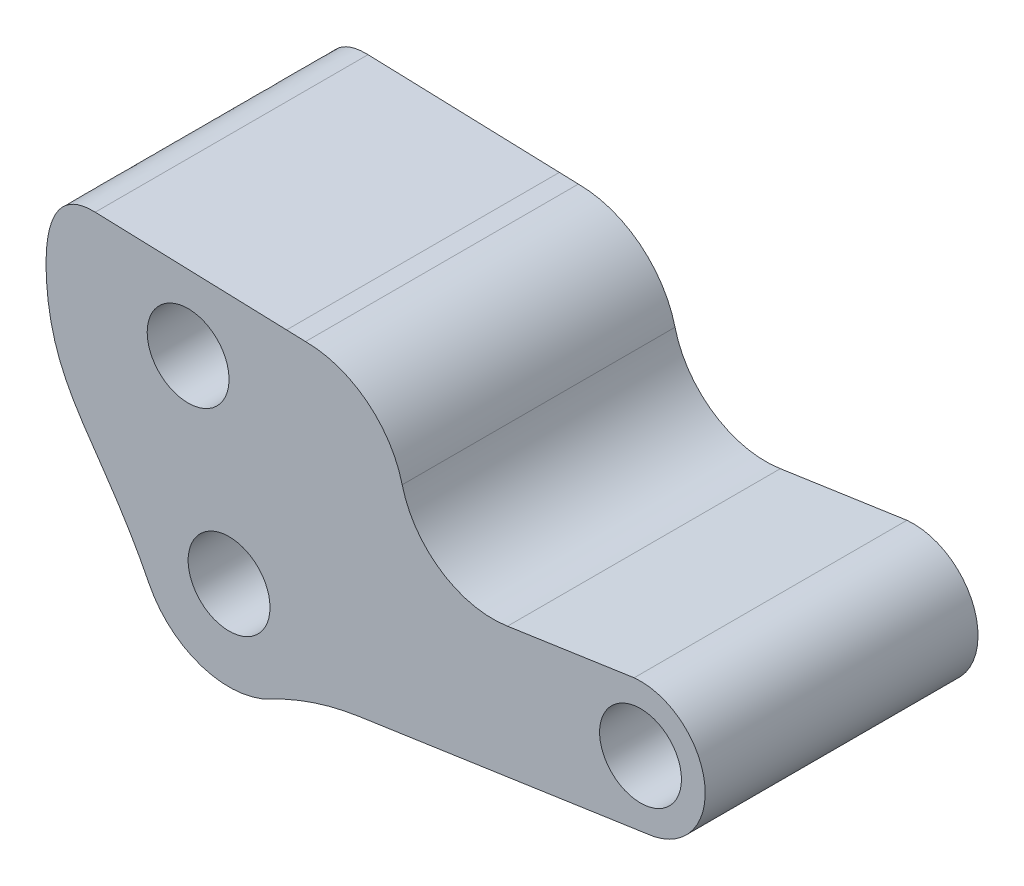
ISO-10303-21;
HEADER;
FILE_DESCRIPTION(('STEP AP214'),'2;1');
FILE_NAME('part.step','',(''),(''),'','','');
FILE_SCHEMA(('AUTOMOTIVE_DESIGN { 1 0 10303 214 1 1 1 1 }'));
ENDSEC;
DATA;
#1=APPLICATION_CONTEXT('core data for automotive mechanical design processes');
#2=APPLICATION_PROTOCOL_DEFINITION('international standard','automotive_design',2000,#1);
#3=PRODUCT_CONTEXT('',#1,'mechanical');
#4=PRODUCT('Part','Part','',(#3));
#5=PRODUCT_RELATED_PRODUCT_CATEGORY('part','',(#4));
#6=PRODUCT_DEFINITION_FORMATION('','',#4);
#7=PRODUCT_DEFINITION_CONTEXT('part definition',#1,'design');
#8=PRODUCT_DEFINITION('design','',#6,#7);
#9=PRODUCT_DEFINITION_SHAPE('','',#8);
#10=(LENGTH_UNIT() NAMED_UNIT(*) SI_UNIT(.MILLI.,.METRE.));
#11=(NAMED_UNIT(*) PLANE_ANGLE_UNIT() SI_UNIT($,.RADIAN.));
#12=(NAMED_UNIT(*) SI_UNIT($,.STERADIAN.) SOLID_ANGLE_UNIT());
#13=UNCERTAINTY_MEASURE_WITH_UNIT(LENGTH_MEASURE(1.E-05),#10,'distance_accuracy_value','');
#14=(GEOMETRIC_REPRESENTATION_CONTEXT(3) GLOBAL_UNCERTAINTY_ASSIGNED_CONTEXT((#13)) GLOBAL_UNIT_ASSIGNED_CONTEXT((#10,
#11,#12)) REPRESENTATION_CONTEXT('',''));
#15=CARTESIAN_POINT('',(0.,0.,0.));
#16=DIRECTION('',(0.,0.,1.));
#17=DIRECTION('',(1.,0.,0.));
#18=AXIS2_PLACEMENT_3D('',#15,#16,#17);
#19=CARTESIAN_POINT('',(158.097461394552,151.287034217778,10.));
#20=CARTESIAN_POINT('',(158.325870366883,151.272612557795,10.));
#21=CARTESIAN_POINT('',(158.557802913186,151.26421995616,10.));
#22=CARTESIAN_POINT('',(158.793350908443,151.26421995616,10.));
#23=B_SPLINE_CURVE_WITH_KNOTS('',3,(#19,#20,#21,#22),.UNSPECIFIED.,.F.,.F.,(4,4),
(0.972871191917009,1.),.UNSPECIFIED.);
#24=DIRECTION('',(0.,0.,-1.));
#25=VECTOR('',#24,1.);
#26=SURFACE_OF_LINEAR_EXTRUSION('',#23,#25);
#27=CARTESIAN_POINT('',(158.097461394552,151.287034217778,0.));
#28=CARTESIAN_POINT('',(158.325870366883,151.272612557795,0.));
#29=CARTESIAN_POINT('',(158.557802913186,151.26421995616,0.));
#30=CARTESIAN_POINT('',(158.793350908443,151.26421995616,0.));
#31=B_SPLINE_CURVE_WITH_KNOTS('',3,(#27,#28,#29,#30),.UNSPECIFIED.,.F.,.F.,(4,4),
(0.972871191917009,1.),.UNSPECIFIED.);
#32=CARTESIAN_POINT('',(158.097461394552,151.287034217778,0.));
#33=VERTEX_POINT('',#32);
#34=CARTESIAN_POINT('',(158.793350908443,151.26421995616,0.));
#35=VERTEX_POINT('',#34);
#36=EDGE_CURVE('E148',#33,#35,#31,.T.);
#37=ORIENTED_EDGE('',*,*,#36,.F.);
#38=DIRECTION('',(0.,0.,-1.));
#39=VECTOR('',#38,1.);
#40=CARTESIAN_POINT('',(158.097461394552,151.287034217778,10.));
#41=LINE('',#40,#39);
#42=CARTESIAN_POINT('',(158.097461394552,151.287034217778,10.));
#43=VERTEX_POINT('',#42);
#44=EDGE_CURVE('E11',#43,#33,#41,.T.);
#45=ORIENTED_EDGE('',*,*,#44,.F.);
#46=CARTESIAN_POINT('',(158.793350908443,151.26421995616,10.));
#47=VERTEX_POINT('',#46);
#48=EDGE_CURVE('E186',#43,#47,#23,.T.);
#49=ORIENTED_EDGE('',*,*,#48,.T.);
#50=DIRECTION('',(0.,0.,-1.));
#51=VECTOR('',#50,1.);
#52=CARTESIAN_POINT('',(158.793350908443,151.26421995616,10.));
#53=LINE('',#52,#51);
#54=EDGE_CURVE('E92',#47,#35,#53,.T.);
#55=ORIENTED_EDGE('',*,*,#54,.T.);
#56=EDGE_LOOP('',(#37,#45,#49,#55));
#57=FACE_BOUND('',#56,.T.);
#58=ADVANCED_FACE('F35',(#57),#26,.T.);
#59=CARTESIAN_POINT('',(5.12425924973423,156.302155993108,10.));
#60=DIRECTION('',(-0.0327667115596233,-0.999463027136856,0.));
#61=DIRECTION('',(0.999463027136856,-0.0327667115596233,0.));
#62=AXIS2_PLACEMENT_3D('',#59,#60,#61);
#63=PLANE('',#62);
#64=DIRECTION('',(-0.999463027136856,0.0327667115596233,0.));
#65=VECTOR('',#64,1.);
#66=CARTESIAN_POINT('',(5.12425924973423,156.302155993108,0.));
#67=LINE('',#66,#65);
#68=CARTESIAN_POINT('',(151.083645878014,151.516977360969,0.));
#69=VERTEX_POINT('',#68);
#70=EDGE_CURVE('E153',#33,#69,#67,.T.);
#71=ORIENTED_EDGE('',*,*,#70,.T.);
#72=DIRECTION('',(0.,0.,-1.));
#73=VECTOR('',#72,1.);
#74=CARTESIAN_POINT('',(151.083645878014,151.516977360969,10.));
#75=LINE('',#74,#73);
#76=CARTESIAN_POINT('',(151.083645878014,151.516977360969,10.));
#77=VERTEX_POINT('',#76);
#78=EDGE_CURVE('E44',#77,#69,#75,.T.);
#79=ORIENTED_EDGE('',*,*,#78,.F.);
#80=DIRECTION('',(-0.999463027136856,0.0327667115596233,0.));
#81=VECTOR('',#80,1.);
#82=CARTESIAN_POINT('',(5.12425924973423,156.302155993108,10.));
#83=LINE('',#82,#81);
#84=EDGE_CURVE('E237',#43,#77,#83,.T.);
#85=ORIENTED_EDGE('',*,*,#84,.F.);
#86=ORIENTED_EDGE('',*,*,#44,.T.);
#87=EDGE_LOOP('',(#71,#79,#85,#86));
#88=FACE_BOUND('',#87,.T.);
#89=ADVANCED_FACE('F244',(#88),#63,.F.);
#90=CARTESIAN_POINT('',(151.083645878014,151.516977360969,10.));
#91=CARTESIAN_POINT('',(149.34252916832,151.574058681107,10.));
#92=CARTESIAN_POINT('',(148.841703129865,145.368566224032,10.));
#93=CARTESIAN_POINT('',(151.284095970482,144.263107249584,10.));
#94=CARTESIAN_POINT('',(153.059001839225,140.708421316186,10.));
#95=B_SPLINE_CURVE_WITH_KNOTS('',3,(#90,#91,#92,#93,#94),.UNSPECIFIED.,.F.,.F.,(4,1,4),(0.,
0.305758730908958,1.),.UNSPECIFIED.);
#96=DIRECTION('',(0.,0.,-1.));
#97=VECTOR('',#96,1.);
#98=SURFACE_OF_LINEAR_EXTRUSION('',#95,#97);
#99=CARTESIAN_POINT('',(151.083645878014,151.516977360969,0.));
#100=CARTESIAN_POINT('',(149.34252916832,151.574058681107,0.));
#101=CARTESIAN_POINT('',(148.841703129865,145.368566224032,0.));
#102=CARTESIAN_POINT('',(151.284095970482,144.263107249584,0.));
#103=CARTESIAN_POINT('',(153.059001839225,140.708421316186,0.));
#104=B_SPLINE_CURVE_WITH_KNOTS('',3,(#99,#100,#101,#102,#103),.UNSPECIFIED.,.F.,.F.,(4,1,4),(0.,
0.305758730908958,1.),.UNSPECIFIED.);
#105=CARTESIAN_POINT('',(153.059001839224,140.708421316186,0.));
#106=VERTEX_POINT('',#105);
#107=EDGE_CURVE('E159',#69,#106,#104,.T.);
#108=ORIENTED_EDGE('',*,*,#107,.T.);
#109=DIRECTION('',(0.,0.,-1.));
#110=VECTOR('',#109,1.);
#111=CARTESIAN_POINT('',(153.059001839224,140.708421316186,10.));
#112=LINE('',#111,#110);
#113=CARTESIAN_POINT('',(153.059001839224,140.708421316186,10.));
#114=VERTEX_POINT('',#113);
#115=EDGE_CURVE('E199',#114,#106,#112,.T.);
#116=ORIENTED_EDGE('',*,*,#115,.F.);
#117=EDGE_CURVE('E208',#77,#114,#95,.T.);
#118=ORIENTED_EDGE('',*,*,#117,.F.);
#119=ORIENTED_EDGE('',*,*,#78,.T.);
#120=EDGE_LOOP('',(#108,#116,#118,#119));
#121=FACE_BOUND('',#120,.T.);
#122=ADVANCED_FACE('F206',(#121),#98,.F.);
#123=CARTESIAN_POINT('',(155.989754871759,142.17178850382,10.));
#124=DIRECTION('',(0.,0.,-1.));
#125=DIRECTION('',(-1.,0.,0.));
#126=AXIS2_PLACEMENT_3D('',#123,#124,#125);
#127=CYLINDRICAL_SURFACE('',#126,3.27578339692294);
#128=CARTESIAN_POINT('',(155.989754871759,142.17178850382,0.));
#129=DIRECTION('',(0.,0.,1.));
#130=DIRECTION('',(1.,0.,0.));
#131=AXIS2_PLACEMENT_3D('',#128,#129,#130);
#132=CIRCLE('',#131,3.27578339692294);
#133=CARTESIAN_POINT('',(157.529461724964,139.28041172627,0.));
#134=VERTEX_POINT('',#133);
#135=EDGE_CURVE('E163',#106,#134,#132,.T.);
#136=ORIENTED_EDGE('',*,*,#135,.T.);
#137=DIRECTION('',(0.,0.,-1.));
#138=VECTOR('',#137,1.);
#139=CARTESIAN_POINT('',(157.529461724964,139.28041172627,10.));
#140=LINE('',#139,#138);
#141=CARTESIAN_POINT('',(157.529461724964,139.28041172627,10.));
#142=VERTEX_POINT('',#141);
#143=EDGE_CURVE('E196',#142,#134,#140,.T.);
#144=ORIENTED_EDGE('',*,*,#143,.F.);
#145=CARTESIAN_POINT('',(155.989754871759,142.17178850382,10.));
#146=DIRECTION('',(0.,0.,1.));
#147=DIRECTION('',(1.,0.,0.));
#148=AXIS2_PLACEMENT_3D('',#145,#146,#147);
#149=CIRCLE('',#148,3.27578339692294);
#150=EDGE_CURVE('E228',#114,#142,#149,.T.);
#151=ORIENTED_EDGE('',*,*,#150,.F.);
#152=ORIENTED_EDGE('',*,*,#115,.T.);
#153=EDGE_LOOP('',(#136,#144,#151,#152));
#154=FACE_BOUND('',#153,.T.);
#155=ADVANCED_FACE('F219',(#154),#127,.T.);
#156=CARTESIAN_POINT('',(162.229732367558,130.453891693644,10.));
#157=DIRECTION('',(0.,0.,-1.));
#158=DIRECTION('',(-1.,0.,0.));
#159=AXIS2_PLACEMENT_3D('',#156,#157,#158);
#160=CYLINDRICAL_SURFACE('',#159,9.99999999999886);
#161=CARTESIAN_POINT('',(162.229732367558,130.453891693644,0.));
#162=DIRECTION('',(0.,0.,1.));
#163=DIRECTION('',(1.,0.,0.));
#164=AXIS2_PLACEMENT_3D('',#161,#162,#163);
#165=CIRCLE('',#164,9.99999999999886);
#166=CARTESIAN_POINT('',(160.775008350177,140.347514793057,0.));
#167=VERTEX_POINT('',#166);
#168=EDGE_CURVE('E168',#134,#167,#165,.F.);
#169=ORIENTED_EDGE('',*,*,#168,.T.);
#170=DIRECTION('',(0.,0.,-1.));
#171=VECTOR('',#170,1.);
#172=CARTESIAN_POINT('',(160.775008350177,140.347514793057,10.));
#173=LINE('',#172,#171);
#174=CARTESIAN_POINT('',(160.775008350177,140.347514793057,10.));
#175=VERTEX_POINT('',#174);
#176=EDGE_CURVE('E193',#175,#167,#173,.T.);
#177=ORIENTED_EDGE('',*,*,#176,.F.);
#178=CARTESIAN_POINT('',(162.229732367558,130.453891693644,10.));
#179=DIRECTION('',(0.,0.,1.));
#180=DIRECTION('',(1.,0.,0.));
#181=AXIS2_PLACEMENT_3D('',#178,#179,#180);
#182=CIRCLE('',#181,9.99999999999886);
#183=EDGE_CURVE('E225',#142,#175,#182,.F.);
#184=ORIENTED_EDGE('',*,*,#183,.F.);
#185=ORIENTED_EDGE('',*,*,#143,.T.);
#186=EDGE_LOOP('',(#169,#177,#184,#185));
#187=FACE_BOUND('',#186,.T.);
#188=ADVANCED_FACE('F223',(#187),#160,.F.);
#189=CARTESIAN_POINT('',(-16.7971475903416,114.237921020484,10.));
#190=DIRECTION('',(-0.14547240173801,0.989362309941396,0.));
#191=DIRECTION('',(-0.989362309941396,-0.14547240173801,0.));
#192=AXIS2_PLACEMENT_3D('',#189,#190,#191);
#193=PLANE('',#192);
#194=DIRECTION('',(0.989362309941396,0.14547240173801,0.));
#195=VECTOR('',#194,1.);
#196=CARTESIAN_POINT('',(-16.7971475903416,114.237921020484,0.));
#197=LINE('',#196,#195);
#198=CARTESIAN_POINT('',(171.304889345962,141.8957919642,0.));
#199=VERTEX_POINT('',#198);
#200=EDGE_CURVE('E170',#167,#199,#197,.T.);
#201=ORIENTED_EDGE('',*,*,#200,.T.);
#202=DIRECTION('',(0.,0.,-1.));
#203=VECTOR('',#202,1.);
#204=CARTESIAN_POINT('',(171.304889345962,141.8957919642,10.));
#205=LINE('',#204,#203);
#206=CARTESIAN_POINT('',(171.304889345962,141.8957919642,10.));
#207=VERTEX_POINT('',#206);
#208=EDGE_CURVE('E190',#207,#199,#205,.T.);
#209=ORIENTED_EDGE('',*,*,#208,.F.);
#210=DIRECTION('',(0.989362309941396,0.14547240173801,0.));
#211=VECTOR('',#210,1.);
#212=CARTESIAN_POINT('',(-16.7971475903416,114.237921020484,10.));
#213=LINE('',#212,#211);
#214=EDGE_CURVE('E227',#175,#207,#213,.T.);
#215=ORIENTED_EDGE('',*,*,#214,.F.);
#216=ORIENTED_EDGE('',*,*,#176,.T.);
#217=EDGE_LOOP('',(#201,#209,#215,#216));
#218=FACE_BOUND('',#217,.T.);
#219=ADVANCED_FACE('F295',(#218),#193,.F.);
#220=CARTESIAN_POINT('',(171.071219780309,144.254888825512,10.));
#221=DIRECTION('',(0.,0.,-1.));
#222=DIRECTION('',(-1.,0.,0.));
#223=AXIS2_PLACEMENT_3D('',#220,#221,#222);
#224=CYLINDRICAL_SURFACE('',#223,2.37064115102986);
#225=CARTESIAN_POINT('',(171.071219780309,144.254888825512,0.));
#226=DIRECTION('',(0.,0.,1.));
#227=DIRECTION('',(1.,0.,0.));
#228=AXIS2_PLACEMENT_3D('',#225,#226,#227);
#229=CIRCLE('',#228,2.37064115102986);
#230=CARTESIAN_POINT('',(170.837550214656,146.613985686821,0.));
#231=VERTEX_POINT('',#230);
#232=EDGE_CURVE('E172',#199,#231,#229,.T.);
#233=ORIENTED_EDGE('',*,*,#232,.T.);
#234=DIRECTION('',(0.,0.,-1.));
#235=VECTOR('',#234,1.);
#236=CARTESIAN_POINT('',(170.837550214656,146.613985686821,10.));
#237=LINE('',#236,#235);
#238=CARTESIAN_POINT('',(170.837550214656,146.613985686821,10.));
#239=VERTEX_POINT('',#238);
#240=EDGE_CURVE('E128',#239,#231,#237,.T.);
#241=ORIENTED_EDGE('',*,*,#240,.F.);
#242=CARTESIAN_POINT('',(171.071219780309,144.254888825512,10.));
#243=DIRECTION('',(0.,0.,1.));
#244=DIRECTION('',(1.,0.,0.));
#245=AXIS2_PLACEMENT_3D('',#242,#243,#244);
#246=CIRCLE('',#245,2.37064115102986);
#247=EDGE_CURVE('E134',#207,#239,#246,.T.);
#248=ORIENTED_EDGE('',*,*,#247,.F.);
#249=ORIENTED_EDGE('',*,*,#208,.T.);
#250=EDGE_LOOP('',(#233,#241,#248,#249));
#251=FACE_BOUND('',#250,.T.);
#252=ADVANCED_FACE('F292',(#251),#224,.T.);
#253=CARTESIAN_POINT('',(-17.4861031372472,118.92352903424,10.));
#254=DIRECTION('',(-0.145472401737759,0.989362309941433,0.));
#255=DIRECTION('',(-0.989362309941433,-0.145472401737759,0.));
#256=AXIS2_PLACEMENT_3D('',#253,#254,#255);
#257=PLANE('',#256);
#258=DIRECTION('',(0.989362309941433,0.145472401737759,0.));
#259=VECTOR('',#258,1.);
#260=CARTESIAN_POINT('',(-17.4861031372472,118.92352903424,0.));
#261=LINE('',#260,#259);
#262=CARTESIAN_POINT('',(166.196116566183,145.931525385306,0.));
#263=VERTEX_POINT('',#262);
#264=EDGE_CURVE('E123',#263,#231,#261,.T.);
#265=ORIENTED_EDGE('',*,*,#264,.F.);
#266=DIRECTION('',(0.,0.,-1.));
#267=VECTOR('',#266,1.);
#268=CARTESIAN_POINT('',(166.196116566183,145.931525385306,10.));
#269=LINE('',#268,#267);
#270=CARTESIAN_POINT('',(166.196116566183,145.931525385306,10.));
#271=VERTEX_POINT('',#270);
#272=EDGE_CURVE('E118',#271,#263,#269,.T.);
#273=ORIENTED_EDGE('',*,*,#272,.F.);
#274=DIRECTION('',(0.989362309941433,0.145472401737759,0.));
#275=VECTOR('',#274,1.);
#276=CARTESIAN_POINT('',(-17.4861031372472,118.92352903424,10.));
#277=LINE('',#276,#275);
#278=EDGE_CURVE('E121',#271,#239,#277,.T.);
#279=ORIENTED_EDGE('',*,*,#278,.T.);
#280=ORIENTED_EDGE('',*,*,#240,.T.);
#281=EDGE_LOOP('',(#265,#273,#279,#280));
#282=FACE_BOUND('',#281,.T.);
#283=ADVANCED_FACE('F120',(#282),#257,.T.);
#284=CARTESIAN_POINT('',(165.658177806231,149.310946974297,10.));
#285=DIRECTION('',(0.,0.,-1.));
#286=DIRECTION('',(-1.,0.,0.));
#287=AXIS2_PLACEMENT_3D('',#284,#285,#286);
#288=CYLINDRICAL_SURFACE('',#287,3.42196849570472);
#289=CARTESIAN_POINT('',(165.658177806231,149.310946974297,0.));
#290=DIRECTION('',(0.,0.,1.));
#291=DIRECTION('',(1.,0.,0.));
#292=AXIS2_PLACEMENT_3D('',#289,#290,#291);
#293=CIRCLE('',#292,3.42196849570472);
#294=CARTESIAN_POINT('',(162.336090633124,148.490212425326,0.));
#295=VERTEX_POINT('',#294);
#296=EDGE_CURVE('E176',#295,#263,#293,.T.);
#297=ORIENTED_EDGE('',*,*,#296,.F.);
#298=DIRECTION('',(0.,0.,-1.));
#299=VECTOR('',#298,1.);
#300=CARTESIAN_POINT('',(162.336090633124,148.490212425326,10.));
#301=LINE('',#300,#299);
#302=CARTESIAN_POINT('',(162.336090633124,148.490212425326,10.));
#303=VERTEX_POINT('',#302);
#304=EDGE_CURVE('E85',#303,#295,#301,.T.);
#305=ORIENTED_EDGE('',*,*,#304,.F.);
#306=CARTESIAN_POINT('',(165.658177806231,149.310946974297,10.));
#307=DIRECTION('',(0.,0.,1.));
#308=DIRECTION('',(1.,0.,0.));
#309=AXIS2_PLACEMENT_3D('',#306,#307,#308);
#310=CIRCLE('',#309,3.42196849570472);
#311=EDGE_CURVE('E132',#303,#271,#310,.T.);
#312=ORIENTED_EDGE('',*,*,#311,.T.);
#313=ORIENTED_EDGE('',*,*,#272,.T.);
#314=EDGE_LOOP('',(#297,#305,#312,#313));
#315=FACE_BOUND('',#314,.T.);
#316=ADVANCED_FACE('F137',(#315),#288,.F.);
#317=CARTESIAN_POINT('',(155.989754871759,142.17178850382,10.));
#318=DIRECTION('',(0.,0.,-1.));
#319=DIRECTION('',(-1.,0.,0.));
#320=AXIS2_PLACEMENT_3D('',#317,#318,#319);
#321=CYLINDRICAL_SURFACE('',#320,1.5);
#322=CARTESIAN_POINT('',(155.989754871759,142.17178850382,10.));
#323=DIRECTION('',(0.,0.,1.));
#324=DIRECTION('',(1.,0.,0.));
#325=AXIS2_PLACEMENT_3D('',#322,#323,#324);
#326=CIRCLE('',#325,1.5);
#327=CARTESIAN_POINT('',(157.489754871759,142.17178850382,10.));
#328=VERTEX_POINT('',#327);
#329=EDGE_CURVE('E139',#328,#328,#326,.T.);
#330=ORIENTED_EDGE('',*,*,#329,.T.);
#331=EDGE_LOOP('',(#330));
#332=FACE_BOUND('',#331,.T.);
#333=CARTESIAN_POINT('',(155.989754871759,142.17178850382,0.));
#334=DIRECTION('',(0.,0.,1.));
#335=DIRECTION('',(1.,0.,0.));
#336=AXIS2_PLACEMENT_3D('',#333,#334,#335);
#337=CIRCLE('',#336,1.5);
#338=CARTESIAN_POINT('',(157.489754871759,142.17178850382,0.));
#339=VERTEX_POINT('',#338);
#340=EDGE_CURVE('E180',#339,#339,#337,.T.);
#341=ORIENTED_EDGE('',*,*,#340,.F.);
#342=EDGE_LOOP('',(#341));
#343=FACE_BOUND('',#342,.T.);
#344=ADVANCED_FACE('F282',(#332,#343),#321,.F.);
#345=CARTESIAN_POINT('',(158.793350908443,147.614964805819,10.));
#346=DIRECTION('',(0.,0.,-1.));
#347=DIRECTION('',(-1.,0.,0.));
#348=AXIS2_PLACEMENT_3D('',#345,#346,#347);
#349=CYLINDRICAL_SURFACE('',#348,3.64925515034049);
#350=CARTESIAN_POINT('',(158.793350908443,147.614964805819,0.));
#351=DIRECTION('',(0.,0.,1.));
#352=DIRECTION('',(1.,0.,0.));
#353=AXIS2_PLACEMENT_3D('',#350,#351,#352);
#354=CIRCLE('',#353,3.64925515034049);
#355=EDGE_CURVE('E178',#295,#35,#354,.T.);
#356=ORIENTED_EDGE('',*,*,#355,.T.);
#357=ORIENTED_EDGE('',*,*,#54,.F.);
#358=CARTESIAN_POINT('',(158.793350908443,147.614964805819,10.));
#359=DIRECTION('',(0.,0.,1.));
#360=DIRECTION('',(1.,0.,0.));
#361=AXIS2_PLACEMENT_3D('',#358,#359,#360);
#362=CIRCLE('',#361,3.64925515034049);
#363=EDGE_CURVE('E52',#303,#47,#362,.T.);
#364=ORIENTED_EDGE('',*,*,#363,.F.);
#365=ORIENTED_EDGE('',*,*,#304,.T.);
#366=EDGE_LOOP('',(#356,#357,#364,#365));
#367=FACE_BOUND('',#366,.T.);
#368=ADVANCED_FACE('F280',(#367),#349,.T.);
#369=CARTESIAN_POINT('',(171.071219780309,144.254888825512,10.));
#370=DIRECTION('',(0.,0.,-1.));
#371=DIRECTION('',(-1.,0.,0.));
#372=AXIS2_PLACEMENT_3D('',#369,#370,#371);
#373=CYLINDRICAL_SURFACE('',#372,1.5);
#374=CARTESIAN_POINT('',(171.071219780309,144.254888825512,10.));
#375=DIRECTION('',(0.,0.,1.));
#376=DIRECTION('',(1.,0.,0.));
#377=AXIS2_PLACEMENT_3D('',#374,#375,#376);
#378=CIRCLE('',#377,1.5);
#379=CARTESIAN_POINT('',(172.571219780309,144.254888825512,10.));
#380=VERTEX_POINT('',#379);
#381=EDGE_CURVE('E145',#380,#380,#378,.T.);
#382=ORIENTED_EDGE('',*,*,#381,.T.);
#383=EDGE_LOOP('',(#382));
#384=FACE_BOUND('',#383,.T.);
#385=CARTESIAN_POINT('',(171.071219780309,144.254888825512,0.));
#386=DIRECTION('',(0.,0.,1.));
#387=DIRECTION('',(1.,0.,0.));
#388=AXIS2_PLACEMENT_3D('',#385,#386,#387);
#389=CIRCLE('',#388,1.5);
#390=CARTESIAN_POINT('',(172.571219780309,144.254888825512,0.));
#391=VERTEX_POINT('',#390);
#392=EDGE_CURVE('E183',#391,#391,#389,.T.);
#393=ORIENTED_EDGE('',*,*,#392,.F.);
#394=EDGE_LOOP('',(#393));
#395=FACE_BOUND('',#394,.T.);
#396=ADVANCED_FACE('F275',(#384,#395),#373,.F.);
#397=CARTESIAN_POINT('',(0.,0.,10.));
#398=DIRECTION('',(0.,0.,1.));
#399=DIRECTION('',(1.,0.,0.));
#400=AXIS2_PLACEMENT_3D('',#397,#398,#399);
#401=PLANE('',#400);
#402=CARTESIAN_POINT('',(154.488550327068,148.660392738553,10.));
#403=DIRECTION('',(0.,0.,-1.));
#404=DIRECTION('',(-1.,0.,0.));
#405=AXIS2_PLACEMENT_3D('',#402,#403,#404);
#406=CIRCLE('',#405,1.5);
#407=CARTESIAN_POINT('',(152.988550327068,148.660392738553,10.));
#408=VERTEX_POINT('',#407);
#409=EDGE_CURVE('E154',#408,#408,#406,.T.);
#410=ORIENTED_EDGE('',*,*,#409,.T.);
#411=EDGE_LOOP('',(#410));
#412=FACE_BOUND('',#411,.T.);
#413=ORIENTED_EDGE('',*,*,#48,.F.);
#414=ORIENTED_EDGE('',*,*,#84,.T.);
#415=ORIENTED_EDGE('',*,*,#117,.T.);
#416=ORIENTED_EDGE('',*,*,#150,.T.);
#417=ORIENTED_EDGE('',*,*,#183,.T.);
#418=ORIENTED_EDGE('',*,*,#214,.T.);
#419=ORIENTED_EDGE('',*,*,#247,.T.);
#420=ORIENTED_EDGE('',*,*,#278,.F.);
#421=ORIENTED_EDGE('',*,*,#311,.F.);
#422=ORIENTED_EDGE('',*,*,#363,.T.);
#423=EDGE_LOOP('',(#413,#414,#415,#416,#417,#418,#419,#420,#421,#422));
#424=FACE_BOUND('',#423,.T.);
#425=ORIENTED_EDGE('',*,*,#329,.F.);
#426=EDGE_LOOP('',(#425));
#427=FACE_BOUND('',#426,.T.);
#428=ORIENTED_EDGE('',*,*,#381,.F.);
#429=EDGE_LOOP('',(#428));
#430=FACE_BOUND('',#429,.T.);
#431=ADVANCED_FACE('F130',(#412,#424,#427,#430),#401,.T.);
#432=CARTESIAN_POINT('',(0.,0.,0.));
#433=DIRECTION('',(0.,0.,1.));
#434=DIRECTION('',(1.,0.,0.));
#435=AXIS2_PLACEMENT_3D('',#432,#433,#434);
#436=PLANE('',#435);
#437=CARTESIAN_POINT('',(154.488550327068,148.660392738553,0.));
#438=DIRECTION('',(0.,0.,-1.));
#439=DIRECTION('',(-1.,0.,0.));
#440=AXIS2_PLACEMENT_3D('',#437,#438,#439);
#441=CIRCLE('',#440,1.5);
#442=CARTESIAN_POINT('',(152.988550327068,148.660392738553,0.));
#443=VERTEX_POINT('',#442);
#444=EDGE_CURVE('E254',#443,#443,#441,.T.);
#445=ORIENTED_EDGE('',*,*,#444,.F.);
#446=EDGE_LOOP('',(#445));
#447=FACE_BOUND('',#446,.T.);
#448=ORIENTED_EDGE('',*,*,#36,.T.);
#449=ORIENTED_EDGE('',*,*,#355,.F.);
#450=ORIENTED_EDGE('',*,*,#296,.T.);
#451=ORIENTED_EDGE('',*,*,#264,.T.);
#452=ORIENTED_EDGE('',*,*,#232,.F.);
#453=ORIENTED_EDGE('',*,*,#200,.F.);
#454=ORIENTED_EDGE('',*,*,#168,.F.);
#455=ORIENTED_EDGE('',*,*,#135,.F.);
#456=ORIENTED_EDGE('',*,*,#107,.F.);
#457=ORIENTED_EDGE('',*,*,#70,.F.);
#458=EDGE_LOOP('',(#448,#449,#450,#451,#452,#453,#454,#455,#456,#457));
#459=FACE_BOUND('',#458,.T.);
#460=ORIENTED_EDGE('',*,*,#340,.T.);
#461=EDGE_LOOP('',(#460));
#462=FACE_BOUND('',#461,.T.);
#463=ORIENTED_EDGE('',*,*,#392,.T.);
#464=EDGE_LOOP('',(#463));
#465=FACE_BOUND('',#464,.T.);
#466=ADVANCED_FACE('F213',(#447,#459,#462,#465),#436,.F.);
#467=CARTESIAN_POINT('',(154.488550327068,148.660392738553,10.));
#468=DIRECTION('',(0.,0.,-1.));
#469=DIRECTION('',(-1.,0.,0.));
#470=AXIS2_PLACEMENT_3D('',#467,#468,#469);
#471=CYLINDRICAL_SURFACE('',#470,1.5);
#472=ORIENTED_EDGE('',*,*,#409,.F.);
#473=EDGE_LOOP('',(#472));
#474=FACE_BOUND('',#473,.T.);
#475=ORIENTED_EDGE('',*,*,#444,.T.);
#476=EDGE_LOOP('',(#475));
#477=FACE_BOUND('',#476,.T.);
#478=ADVANCED_FACE('F264',(#474,#477),#471,.F.);
#479=CLOSED_SHELL('',(#58,#89,#122,#155,#188,#219,#252,#283,#316,#344,#368,#396,#431,#466,#478));
#480=MANIFOLD_SOLID_BREP('B2',#479);
#481=ADVANCED_BREP_SHAPE_REPRESENTATION('',(#18,#480),#14);
#482=SHAPE_DEFINITION_REPRESENTATION(#9,#481);
ENDSEC;
END-ISO-10303-21;
